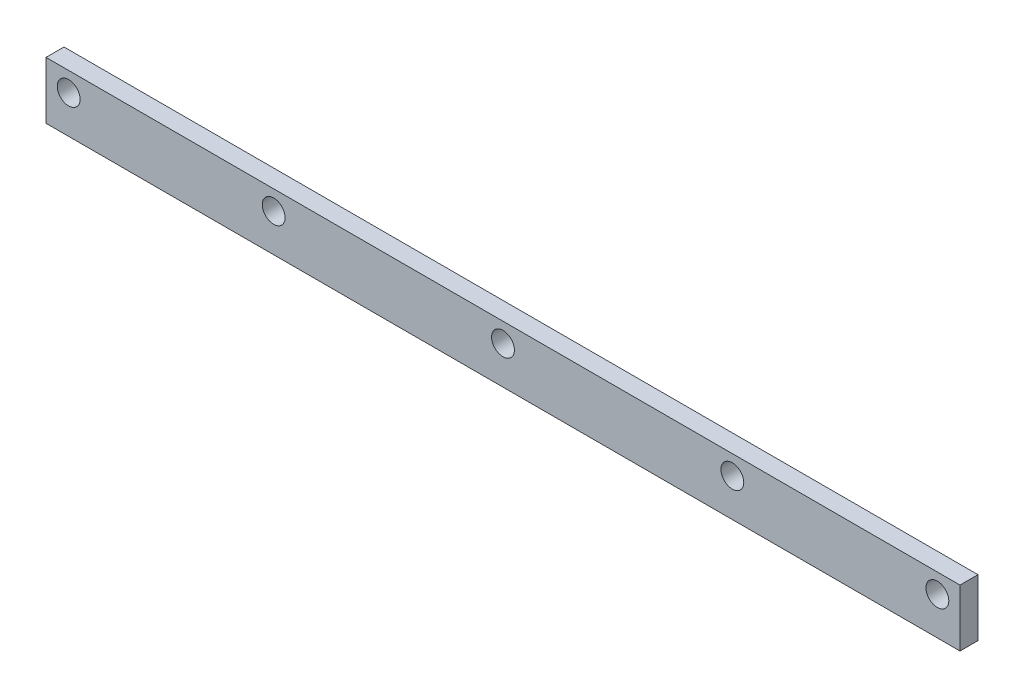
ISO-10303-21;
HEADER;
FILE_DESCRIPTION(('STEP AP214'),'2;1');
FILE_NAME('part.step','',(''),(''),'','','');
FILE_SCHEMA(('AUTOMOTIVE_DESIGN { 1 0 10303 214 1 1 1 1 }'));
ENDSEC;
DATA;
#1=APPLICATION_CONTEXT('core data for automotive mechanical design processes');
#2=APPLICATION_PROTOCOL_DEFINITION('international standard','automotive_design',2000,#1);
#3=PRODUCT_CONTEXT('',#1,'mechanical');
#4=PRODUCT('Part','Part','',(#3));
#5=PRODUCT_RELATED_PRODUCT_CATEGORY('part','',(#4));
#6=PRODUCT_DEFINITION_FORMATION('','',#4);
#7=PRODUCT_DEFINITION_CONTEXT('part definition',#1,'design');
#8=PRODUCT_DEFINITION('design','',#6,#7);
#9=PRODUCT_DEFINITION_SHAPE('','',#8);
#10=(LENGTH_UNIT() NAMED_UNIT(*) SI_UNIT(.MILLI.,.METRE.));
#11=(NAMED_UNIT(*) PLANE_ANGLE_UNIT() SI_UNIT($,.RADIAN.));
#12=(NAMED_UNIT(*) SI_UNIT($,.STERADIAN.) SOLID_ANGLE_UNIT());
#13=UNCERTAINTY_MEASURE_WITH_UNIT(LENGTH_MEASURE(1.E-05),#10,'distance_accuracy_value','');
#14=(GEOMETRIC_REPRESENTATION_CONTEXT(3) GLOBAL_UNCERTAINTY_ASSIGNED_CONTEXT((#13)) GLOBAL_UNIT_ASSIGNED_CONTEXT((#10,
#11,#12)) REPRESENTATION_CONTEXT('',''));
#15=CARTESIAN_POINT('',(0.,0.,0.));
#16=DIRECTION('',(0.,0.,1.));
#17=DIRECTION('',(1.,0.,0.));
#18=AXIS2_PLACEMENT_3D('',#15,#16,#17);
#19=CARTESIAN_POINT('',(0.,0.,2.));
#20=DIRECTION('',(0.,0.,1.));
#21=DIRECTION('',(1.,0.,0.));
#22=AXIS2_PLACEMENT_3D('',#19,#20,#21);
#23=PLANE('',#22);
#24=CARTESIAN_POINT('',(0.,8.39889607557412,2.));
#25=DIRECTION('',(0.,0.,1.));
#26=DIRECTION('',(1.,0.,0.));
#27=AXIS2_PLACEMENT_3D('',#24,#25,#26);
#28=CIRCLE('',#27,2.54);
#29=CARTESIAN_POINT('',(2.54,8.39889607557412,2.));
#30=VERTEX_POINT('',#29);
#31=EDGE_CURVE('E129',#30,#30,#28,.T.);
#32=ORIENTED_EDGE('',*,*,#31,.F.);
#33=EDGE_LOOP('',(#32));
#34=FACE_BOUND('',#33,.T.);
#35=CARTESIAN_POINT('',(-50.9847330059411,8.39889607557412,2.));
#36=DIRECTION('',(0.,0.,1.));
#37=DIRECTION('',(1.,0.,0.));
#38=AXIS2_PLACEMENT_3D('',#35,#36,#37);
#39=CIRCLE('',#38,2.54);
#40=CARTESIAN_POINT('',(-48.4447330059411,8.39889607557412,2.));
#41=VERTEX_POINT('',#40);
#42=EDGE_CURVE('E117',#41,#41,#39,.T.);
#43=ORIENTED_EDGE('',*,*,#42,.F.);
#44=EDGE_LOOP('',(#43));
#45=FACE_BOUND('',#44,.T.);
#46=DIRECTION('',(0.,-1.,0.));
#47=VECTOR('',#46,1.);
#48=CARTESIAN_POINT('',(-101.6,12.7,2.));
#49=LINE('',#48,#47);
#50=CARTESIAN_POINT('',(-101.6,12.7,2.));
#51=VERTEX_POINT('',#50);
#52=CARTESIAN_POINT('',(-101.6,0.,2.));
#53=VERTEX_POINT('',#52);
#54=EDGE_CURVE('E87',#51,#53,#49,.T.);
#55=ORIENTED_EDGE('',*,*,#54,.T.);
#56=DIRECTION('',(1.,0.,0.));
#57=VECTOR('',#56,1.);
#58=CARTESIAN_POINT('',(-101.6,0.,2.));
#59=LINE('',#58,#57);
#60=CARTESIAN_POINT('',(101.6,0.,2.));
#61=VERTEX_POINT('',#60);
#62=EDGE_CURVE('E82',#53,#61,#59,.T.);
#63=ORIENTED_EDGE('',*,*,#62,.T.);
#64=DIRECTION('',(0.,1.,0.));
#65=VECTOR('',#64,1.);
#66=CARTESIAN_POINT('',(101.6,12.7,2.));
#67=LINE('',#66,#65);
#68=CARTESIAN_POINT('',(101.6,12.7,2.));
#69=VERTEX_POINT('',#68);
#70=EDGE_CURVE('E85',#61,#69,#67,.T.);
#71=ORIENTED_EDGE('',*,*,#70,.T.);
#72=DIRECTION('',(-1.,0.,0.));
#73=VECTOR('',#72,1.);
#74=CARTESIAN_POINT('',(-101.6,12.7,2.));
#75=LINE('',#74,#73);
#76=EDGE_CURVE('E52',#69,#51,#75,.T.);
#77=ORIENTED_EDGE('',*,*,#76,.T.);
#78=EDGE_LOOP('',(#55,#63,#71,#77));
#79=FACE_BOUND('',#78,.T.);
#80=CARTESIAN_POINT('',(-96.5620428456801,8.39889607557412,2.));
#81=DIRECTION('',(0.,0.,1.));
#82=DIRECTION('',(1.,0.,0.));
#83=AXIS2_PLACEMENT_3D('',#80,#81,#82);
#84=CIRCLE('',#83,2.54);
#85=CARTESIAN_POINT('',(-94.0220428456801,8.39889607557412,2.));
#86=VERTEX_POINT('',#85);
#87=EDGE_CURVE('E102',#86,#86,#84,.T.);
#88=ORIENTED_EDGE('',*,*,#87,.F.);
#89=EDGE_LOOP('',(#88));
#90=FACE_BOUND('',#89,.T.);
#91=CARTESIAN_POINT('',(96.5620428456801,8.39889607557412,2.));
#92=DIRECTION('',(0.,0.,1.));
#93=DIRECTION('',(-1.,0.,0.));
#94=AXIS2_PLACEMENT_3D('',#91,#92,#93);
#95=CIRCLE('',#94,2.54);
#96=CARTESIAN_POINT('',(94.0220428456801,8.39889607557412,2.));
#97=VERTEX_POINT('',#96);
#98=EDGE_CURVE('E123',#97,#97,#95,.T.);
#99=ORIENTED_EDGE('',*,*,#98,.F.);
#100=EDGE_LOOP('',(#99));
#101=FACE_BOUND('',#100,.T.);
#102=CARTESIAN_POINT('',(50.9847330059411,8.39889607557412,2.));
#103=DIRECTION('',(0.,0.,1.));
#104=DIRECTION('',(1.,0.,0.));
#105=AXIS2_PLACEMENT_3D('',#102,#103,#104);
#106=CIRCLE('',#105,2.54);
#107=CARTESIAN_POINT('',(53.5247330059411,8.39889607557412,2.));
#108=VERTEX_POINT('',#107);
#109=EDGE_CURVE('E135',#108,#108,#106,.T.);
#110=ORIENTED_EDGE('',*,*,#109,.F.);
#111=EDGE_LOOP('',(#110));
#112=FACE_BOUND('',#111,.T.);
#113=ADVANCED_FACE('F35',(#34,#45,#79,#90,#101,#112),#23,.T.);
#114=CARTESIAN_POINT('',(0.,0.,-2.));
#115=DIRECTION('',(0.,0.,1.));
#116=DIRECTION('',(1.,0.,0.));
#117=AXIS2_PLACEMENT_3D('',#114,#115,#116);
#118=PLANE('',#117);
#119=DIRECTION('',(0.,-1.,0.));
#120=VECTOR('',#119,1.);
#121=CARTESIAN_POINT('',(-101.6,12.7,-2.));
#122=LINE('',#121,#120);
#123=CARTESIAN_POINT('',(-101.6,12.7,-2.));
#124=VERTEX_POINT('',#123);
#125=CARTESIAN_POINT('',(-101.6,0.,-2.));
#126=VERTEX_POINT('',#125);
#127=EDGE_CURVE('E99',#124,#126,#122,.T.);
#128=ORIENTED_EDGE('',*,*,#127,.F.);
#129=DIRECTION('',(-1.,0.,0.));
#130=VECTOR('',#129,1.);
#131=CARTESIAN_POINT('',(-101.6,12.7,-2.));
#132=LINE('',#131,#130);
#133=CARTESIAN_POINT('',(101.6,12.7,-2.));
#134=VERTEX_POINT('',#133);
#135=EDGE_CURVE('E75',#134,#124,#132,.T.);
#136=ORIENTED_EDGE('',*,*,#135,.F.);
#137=DIRECTION('',(0.,1.,0.));
#138=VECTOR('',#137,1.);
#139=CARTESIAN_POINT('',(101.6,12.7,-2.));
#140=LINE('',#139,#138);
#141=CARTESIAN_POINT('',(101.6,0.,-2.));
#142=VERTEX_POINT('',#141);
#143=EDGE_CURVE('E69',#142,#134,#140,.T.);
#144=ORIENTED_EDGE('',*,*,#143,.F.);
#145=DIRECTION('',(1.,0.,0.));
#146=VECTOR('',#145,1.);
#147=CARTESIAN_POINT('',(-101.6,0.,-2.));
#148=LINE('',#147,#146);
#149=EDGE_CURVE('E91',#126,#142,#148,.T.);
#150=ORIENTED_EDGE('',*,*,#149,.F.);
#151=EDGE_LOOP('',(#128,#136,#144,#150));
#152=FACE_BOUND('',#151,.T.);
#153=CARTESIAN_POINT('',(-96.5620428456801,8.39889607557412,-2.));
#154=DIRECTION('',(0.,0.,1.));
#155=DIRECTION('',(1.,0.,0.));
#156=AXIS2_PLACEMENT_3D('',#153,#154,#155);
#157=CIRCLE('',#156,2.54);
#158=CARTESIAN_POINT('',(-94.0220428456801,8.39889607557412,-2.));
#159=VERTEX_POINT('',#158);
#160=EDGE_CURVE('E114',#159,#159,#157,.T.);
#161=ORIENTED_EDGE('',*,*,#160,.T.);
#162=EDGE_LOOP('',(#161));
#163=FACE_BOUND('',#162,.T.);
#164=CARTESIAN_POINT('',(-50.9847330059411,8.39889607557412,-2.));
#165=DIRECTION('',(0.,0.,1.));
#166=DIRECTION('',(1.,0.,0.));
#167=AXIS2_PLACEMENT_3D('',#164,#165,#166);
#168=CIRCLE('',#167,2.54);
#169=CARTESIAN_POINT('',(-48.4447330059411,8.39889607557412,-2.));
#170=VERTEX_POINT('',#169);
#171=EDGE_CURVE('E120',#170,#170,#168,.T.);
#172=ORIENTED_EDGE('',*,*,#171,.T.);
#173=EDGE_LOOP('',(#172));
#174=FACE_BOUND('',#173,.T.);
#175=CARTESIAN_POINT('',(96.5620428456801,8.39889607557412,-2.));
#176=DIRECTION('',(0.,0.,1.));
#177=DIRECTION('',(-1.,0.,0.));
#178=AXIS2_PLACEMENT_3D('',#175,#176,#177);
#179=CIRCLE('',#178,2.54);
#180=CARTESIAN_POINT('',(94.0220428456801,8.39889607557412,-2.));
#181=VERTEX_POINT('',#180);
#182=EDGE_CURVE('E126',#181,#181,#179,.T.);
#183=ORIENTED_EDGE('',*,*,#182,.T.);
#184=EDGE_LOOP('',(#183));
#185=FACE_BOUND('',#184,.T.);
#186=CARTESIAN_POINT('',(0.,8.39889607557412,-2.));
#187=DIRECTION('',(0.,0.,1.));
#188=DIRECTION('',(1.,0.,0.));
#189=AXIS2_PLACEMENT_3D('',#186,#187,#188);
#190=CIRCLE('',#189,2.54);
#191=CARTESIAN_POINT('',(2.54,8.39889607557412,-2.));
#192=VERTEX_POINT('',#191);
#193=EDGE_CURVE('E132',#192,#192,#190,.T.);
#194=ORIENTED_EDGE('',*,*,#193,.T.);
#195=EDGE_LOOP('',(#194));
#196=FACE_BOUND('',#195,.T.);
#197=CARTESIAN_POINT('',(50.9847330059411,8.39889607557412,-2.));
#198=DIRECTION('',(0.,0.,1.));
#199=DIRECTION('',(1.,0.,0.));
#200=AXIS2_PLACEMENT_3D('',#197,#198,#199);
#201=CIRCLE('',#200,2.54);
#202=CARTESIAN_POINT('',(53.5247330059411,8.39889607557412,-2.));
#203=VERTEX_POINT('',#202);
#204=EDGE_CURVE('E138',#203,#203,#201,.T.);
#205=ORIENTED_EDGE('',*,*,#204,.T.);
#206=EDGE_LOOP('',(#205));
#207=FACE_BOUND('',#206,.T.);
#208=ADVANCED_FACE('F110',(#152,#163,#174,#185,#196,#207),#118,.F.);
#209=CARTESIAN_POINT('',(-101.6,12.7,2.));
#210=DIRECTION('',(1.,0.,0.));
#211=DIRECTION('',(0.,1.,0.));
#212=AXIS2_PLACEMENT_3D('',#209,#210,#211);
#213=PLANE('',#212);
#214=ORIENTED_EDGE('',*,*,#127,.T.);
#215=DIRECTION('',(0.,0.,-1.));
#216=VECTOR('',#215,1.);
#217=CARTESIAN_POINT('',(-101.6,0.,2.));
#218=LINE('',#217,#216);
#219=EDGE_CURVE('E11',#53,#126,#218,.T.);
#220=ORIENTED_EDGE('',*,*,#219,.F.);
#221=ORIENTED_EDGE('',*,*,#54,.F.);
#222=DIRECTION('',(0.,0.,-1.));
#223=VECTOR('',#222,1.);
#224=CARTESIAN_POINT('',(-101.6,12.7,2.));
#225=LINE('',#224,#223);
#226=EDGE_CURVE('E95',#51,#124,#225,.T.);
#227=ORIENTED_EDGE('',*,*,#226,.T.);
#228=EDGE_LOOP('',(#214,#220,#221,#227));
#229=FACE_BOUND('',#228,.T.);
#230=ADVANCED_FACE('F37',(#229),#213,.F.);
#231=CARTESIAN_POINT('',(-101.6,0.,2.));
#232=DIRECTION('',(0.,1.,0.));
#233=DIRECTION('',(0.,0.,1.));
#234=AXIS2_PLACEMENT_3D('',#231,#232,#233);
#235=PLANE('',#234);
#236=ORIENTED_EDGE('',*,*,#149,.T.);
#237=DIRECTION('',(0.,0.,-1.));
#238=VECTOR('',#237,1.);
#239=CARTESIAN_POINT('',(101.6,0.,2.));
#240=LINE('',#239,#238);
#241=EDGE_CURVE('E44',#61,#142,#240,.T.);
#242=ORIENTED_EDGE('',*,*,#241,.F.);
#243=ORIENTED_EDGE('',*,*,#62,.F.);
#244=ORIENTED_EDGE('',*,*,#219,.T.);
#245=EDGE_LOOP('',(#236,#242,#243,#244));
#246=FACE_BOUND('',#245,.T.);
#247=ADVANCED_FACE('F90',(#246),#235,.F.);
#248=CARTESIAN_POINT('',(101.6,12.7,2.));
#249=DIRECTION('',(-1.,0.,0.));
#250=DIRECTION('',(0.,-1.,0.));
#251=AXIS2_PLACEMENT_3D('',#248,#249,#250);
#252=PLANE('',#251);
#253=ORIENTED_EDGE('',*,*,#143,.T.);
#254=DIRECTION('',(0.,0.,-1.));
#255=VECTOR('',#254,1.);
#256=CARTESIAN_POINT('',(101.6,12.7,2.));
#257=LINE('',#256,#255);
#258=EDGE_CURVE('E92',#69,#134,#257,.T.);
#259=ORIENTED_EDGE('',*,*,#258,.F.);
#260=ORIENTED_EDGE('',*,*,#70,.F.);
#261=ORIENTED_EDGE('',*,*,#241,.T.);
#262=EDGE_LOOP('',(#253,#259,#260,#261));
#263=FACE_BOUND('',#262,.T.);
#264=ADVANCED_FACE('F93',(#263),#252,.F.);
#265=CARTESIAN_POINT('',(-101.6,12.7,2.));
#266=DIRECTION('',(0.,-1.,0.));
#267=DIRECTION('',(1.,0.,0.));
#268=AXIS2_PLACEMENT_3D('',#265,#266,#267);
#269=PLANE('',#268);
#270=ORIENTED_EDGE('',*,*,#135,.T.);
#271=ORIENTED_EDGE('',*,*,#226,.F.);
#272=ORIENTED_EDGE('',*,*,#76,.F.);
#273=ORIENTED_EDGE('',*,*,#258,.T.);
#274=EDGE_LOOP('',(#270,#271,#272,#273));
#275=FACE_BOUND('',#274,.T.);
#276=ADVANCED_FACE('F107',(#275),#269,.F.);
#277=CARTESIAN_POINT('',(-96.5620428456801,8.39889607557412,2.));
#278=DIRECTION('',(0.,0.,-1.));
#279=DIRECTION('',(-1.,0.,0.));
#280=AXIS2_PLACEMENT_3D('',#277,#278,#279);
#281=CYLINDRICAL_SURFACE('',#280,2.54);
#282=ORIENTED_EDGE('',*,*,#87,.T.);
#283=EDGE_LOOP('',(#282));
#284=FACE_BOUND('',#283,.T.);
#285=ORIENTED_EDGE('',*,*,#160,.F.);
#286=EDGE_LOOP('',(#285));
#287=FACE_BOUND('',#286,.T.);
#288=ADVANCED_FACE('F157',(#284,#287),#281,.F.);
#289=CARTESIAN_POINT('',(-50.9847330059411,8.39889607557412,2.));
#290=DIRECTION('',(0.,0.,-1.));
#291=DIRECTION('',(-1.,0.,0.));
#292=AXIS2_PLACEMENT_3D('',#289,#290,#291);
#293=CYLINDRICAL_SURFACE('',#292,2.54);
#294=ORIENTED_EDGE('',*,*,#42,.T.);
#295=EDGE_LOOP('',(#294));
#296=FACE_BOUND('',#295,.T.);
#297=ORIENTED_EDGE('',*,*,#171,.F.);
#298=EDGE_LOOP('',(#297));
#299=FACE_BOUND('',#298,.T.);
#300=ADVANCED_FACE('F203',(#296,#299),#293,.F.);
#301=CARTESIAN_POINT('',(96.5620428456801,8.39889607557412,2.));
#302=DIRECTION('',(0.,0.,-1.));
#303=DIRECTION('',(-1.,0.,0.));
#304=AXIS2_PLACEMENT_3D('',#301,#302,#303);
#305=CYLINDRICAL_SURFACE('',#304,2.54);
#306=ORIENTED_EDGE('',*,*,#98,.T.);
#307=EDGE_LOOP('',(#306));
#308=FACE_BOUND('',#307,.T.);
#309=ORIENTED_EDGE('',*,*,#182,.F.);
#310=EDGE_LOOP('',(#309));
#311=FACE_BOUND('',#310,.T.);
#312=ADVANCED_FACE('F211',(#308,#311),#305,.F.);
#313=CARTESIAN_POINT('',(0.,8.39889607557412,2.));
#314=DIRECTION('',(0.,0.,-1.));
#315=DIRECTION('',(-1.,0.,0.));
#316=AXIS2_PLACEMENT_3D('',#313,#314,#315);
#317=CYLINDRICAL_SURFACE('',#316,2.54);
#318=ORIENTED_EDGE('',*,*,#31,.T.);
#319=EDGE_LOOP('',(#318));
#320=FACE_BOUND('',#319,.T.);
#321=ORIENTED_EDGE('',*,*,#193,.F.);
#322=EDGE_LOOP('',(#321));
#323=FACE_BOUND('',#322,.T.);
#324=ADVANCED_FACE('F219',(#320,#323),#317,.F.);
#325=CARTESIAN_POINT('',(50.9847330059411,8.39889607557412,2.));
#326=DIRECTION('',(0.,0.,-1.));
#327=DIRECTION('',(-1.,0.,0.));
#328=AXIS2_PLACEMENT_3D('',#325,#326,#327);
#329=CYLINDRICAL_SURFACE('',#328,2.54);
#330=ORIENTED_EDGE('',*,*,#109,.T.);
#331=EDGE_LOOP('',(#330));
#332=FACE_BOUND('',#331,.T.);
#333=ORIENTED_EDGE('',*,*,#204,.F.);
#334=EDGE_LOOP('',(#333));
#335=FACE_BOUND('',#334,.T.);
#336=ADVANCED_FACE('F144',(#332,#335),#329,.F.);
#337=CLOSED_SHELL('',(#113,#208,#230,#247,#264,#276,#288,#300,#312,#324,#336));
#338=MANIFOLD_SOLID_BREP('B2',#337);
#339=ADVANCED_BREP_SHAPE_REPRESENTATION('',(#18,#338),#14);
#340=SHAPE_DEFINITION_REPRESENTATION(#9,#339);
ENDSEC;
END-ISO-10303-21;
